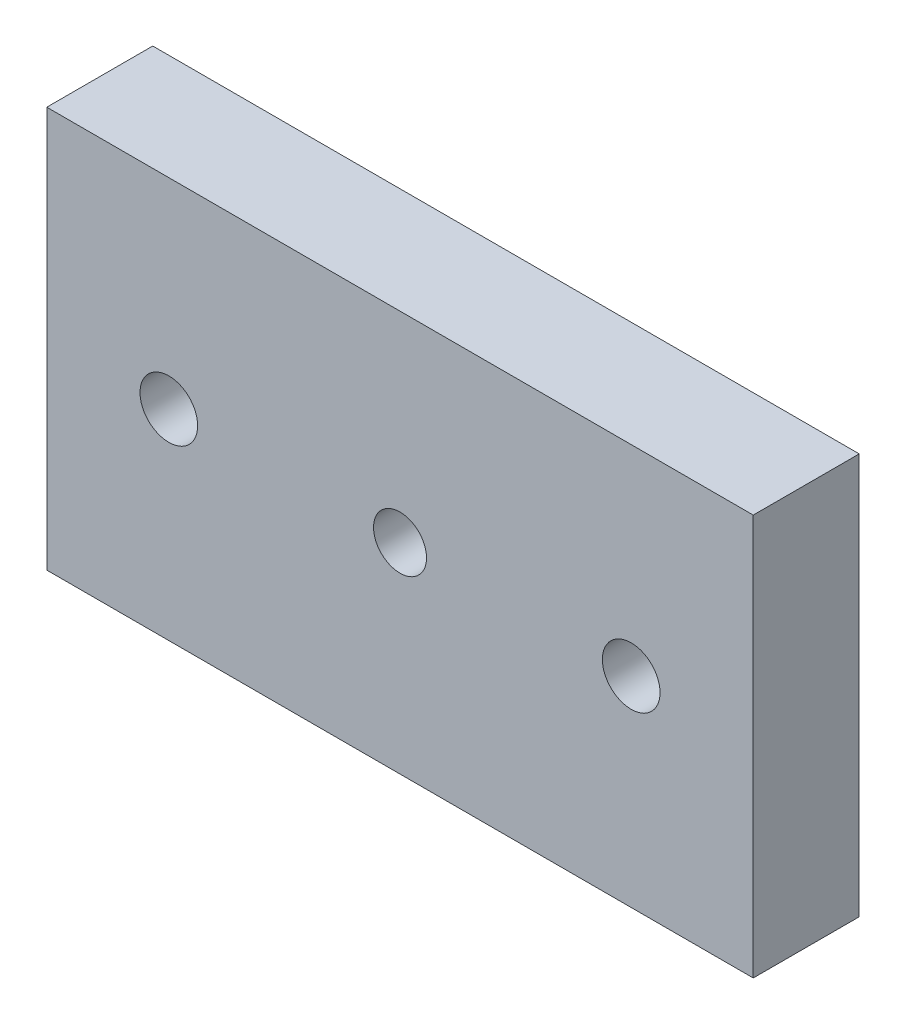
ISO-10303-21;
HEADER;
FILE_DESCRIPTION(('STEP AP214'),'2;1');
FILE_NAME('part.step','',(''),(''),'','','');
FILE_SCHEMA(('AUTOMOTIVE_DESIGN { 1 0 10303 214 1 1 1 1 }'));
ENDSEC;
DATA;
#1=APPLICATION_CONTEXT('core data for automotive mechanical design processes');
#2=APPLICATION_PROTOCOL_DEFINITION('international standard','automotive_design',2000,#1);
#3=PRODUCT_CONTEXT('',#1,'mechanical');
#4=PRODUCT('Part','Part','',(#3));
#5=PRODUCT_RELATED_PRODUCT_CATEGORY('part','',(#4));
#6=PRODUCT_DEFINITION_FORMATION('','',#4);
#7=PRODUCT_DEFINITION_CONTEXT('part definition',#1,'design');
#8=PRODUCT_DEFINITION('design','',#6,#7);
#9=PRODUCT_DEFINITION_SHAPE('','',#8);
#10=(LENGTH_UNIT() NAMED_UNIT(*) SI_UNIT(.MILLI.,.METRE.));
#11=(NAMED_UNIT(*) PLANE_ANGLE_UNIT() SI_UNIT($,.RADIAN.));
#12=(NAMED_UNIT(*) SI_UNIT($,.STERADIAN.) SOLID_ANGLE_UNIT());
#13=UNCERTAINTY_MEASURE_WITH_UNIT(LENGTH_MEASURE(1.E-05),#10,'distance_accuracy_value','');
#14=(GEOMETRIC_REPRESENTATION_CONTEXT(3) GLOBAL_UNCERTAINTY_ASSIGNED_CONTEXT((#13)) GLOBAL_UNIT_ASSIGNED_CONTEXT((#10,
#11,#12)) REPRESENTATION_CONTEXT('',''));
#15=CARTESIAN_POINT('',(0.,0.,0.));
#16=DIRECTION('',(0.,0.,1.));
#17=DIRECTION('',(1.,0.,0.));
#18=AXIS2_PLACEMENT_3D('',#15,#16,#17);
#19=CARTESIAN_POINT('',(20.,11.35,-6.));
#20=DIRECTION('',(1.,0.,0.));
#21=DIRECTION('',(0.,1.,0.));
#22=AXIS2_PLACEMENT_3D('',#19,#20,#21);
#23=PLANE('',#22);
#24=DIRECTION('',(0.,1.,0.));
#25=VECTOR('',#24,1.);
#26=CARTESIAN_POINT('',(20.,11.35,0.));
#27=LINE('',#26,#25);
#28=CARTESIAN_POINT('',(20.,-11.35,0.));
#29=VERTEX_POINT('',#28);
#30=CARTESIAN_POINT('',(20.,11.35,0.));
#31=VERTEX_POINT('',#30);
#32=EDGE_CURVE('E98',#29,#31,#27,.T.);
#33=ORIENTED_EDGE('',*,*,#32,.F.);
#34=DIRECTION('',(0.,0.,1.));
#35=VECTOR('',#34,1.);
#36=CARTESIAN_POINT('',(20.,-11.35,-6.));
#37=LINE('',#36,#35);
#38=CARTESIAN_POINT('',(20.,-11.35,-6.));
#39=VERTEX_POINT('',#38);
#40=EDGE_CURVE('E11',#39,#29,#37,.T.);
#41=ORIENTED_EDGE('',*,*,#40,.F.);
#42=DIRECTION('',(0.,1.,0.));
#43=VECTOR('',#42,1.);
#44=CARTESIAN_POINT('',(20.,11.35,-6.));
#45=LINE('',#44,#43);
#46=CARTESIAN_POINT('',(20.,11.35,-6.));
#47=VERTEX_POINT('',#46);
#48=EDGE_CURVE('E91',#39,#47,#45,.T.);
#49=ORIENTED_EDGE('',*,*,#48,.T.);
#50=DIRECTION('',(0.,0.,1.));
#51=VECTOR('',#50,1.);
#52=CARTESIAN_POINT('',(20.,11.35,-6.));
#53=LINE('',#52,#51);
#54=EDGE_CURVE('E36',#47,#31,#53,.T.);
#55=ORIENTED_EDGE('',*,*,#54,.T.);
#56=EDGE_LOOP('',(#33,#41,#49,#55));
#57=FACE_BOUND('',#56,.T.);
#58=ADVANCED_FACE('F33',(#57),#23,.T.);
#59=CARTESIAN_POINT('',(-20.,-11.35,-6.));
#60=DIRECTION('',(0.,-1.,0.));
#61=DIRECTION('',(0.,0.,-1.));
#62=AXIS2_PLACEMENT_3D('',#59,#60,#61);
#63=PLANE('',#62);
#64=DIRECTION('',(1.,0.,0.));
#65=VECTOR('',#64,1.);
#66=CARTESIAN_POINT('',(-20.,-11.35,0.));
#67=LINE('',#66,#65);
#68=CARTESIAN_POINT('',(-20.,-11.35,0.));
#69=VERTEX_POINT('',#68);
#70=EDGE_CURVE('E93',#69,#29,#67,.T.);
#71=ORIENTED_EDGE('',*,*,#70,.F.);
#72=DIRECTION('',(0.,0.,1.));
#73=VECTOR('',#72,1.);
#74=CARTESIAN_POINT('',(-20.,-11.35,-6.));
#75=LINE('',#74,#73);
#76=CARTESIAN_POINT('',(-20.,-11.35,-6.));
#77=VERTEX_POINT('',#76);
#78=EDGE_CURVE('E42',#77,#69,#75,.T.);
#79=ORIENTED_EDGE('',*,*,#78,.F.);
#80=DIRECTION('',(1.,0.,0.));
#81=VECTOR('',#80,1.);
#82=CARTESIAN_POINT('',(-20.,-11.35,-6.));
#83=LINE('',#82,#81);
#84=EDGE_CURVE('E88',#77,#39,#83,.T.);
#85=ORIENTED_EDGE('',*,*,#84,.T.);
#86=ORIENTED_EDGE('',*,*,#40,.T.);
#87=EDGE_LOOP('',(#71,#79,#85,#86));
#88=FACE_BOUND('',#87,.T.);
#89=ADVANCED_FACE('F109',(#88),#63,.T.);
#90=CARTESIAN_POINT('',(-20.,11.35,-6.));
#91=DIRECTION('',(-1.,0.,0.));
#92=DIRECTION('',(0.,-1.,0.));
#93=AXIS2_PLACEMENT_3D('',#90,#91,#92);
#94=PLANE('',#93);
#95=DIRECTION('',(0.,-1.,0.));
#96=VECTOR('',#95,1.);
#97=CARTESIAN_POINT('',(-20.,11.35,0.));
#98=LINE('',#97,#96);
#99=CARTESIAN_POINT('',(-20.,11.35,0.));
#100=VERTEX_POINT('',#99);
#101=EDGE_CURVE('E83',#100,#69,#98,.T.);
#102=ORIENTED_EDGE('',*,*,#101,.F.);
#103=DIRECTION('',(0.,0.,1.));
#104=VECTOR('',#103,1.);
#105=CARTESIAN_POINT('',(-20.,11.35,-6.));
#106=LINE('',#105,#104);
#107=CARTESIAN_POINT('',(-20.,11.35,-6.));
#108=VERTEX_POINT('',#107);
#109=EDGE_CURVE('E78',#108,#100,#106,.T.);
#110=ORIENTED_EDGE('',*,*,#109,.F.);
#111=DIRECTION('',(0.,-1.,0.));
#112=VECTOR('',#111,1.);
#113=CARTESIAN_POINT('',(-20.,11.35,-6.));
#114=LINE('',#113,#112);
#115=EDGE_CURVE('E81',#108,#77,#114,.T.);
#116=ORIENTED_EDGE('',*,*,#115,.T.);
#117=ORIENTED_EDGE('',*,*,#78,.T.);
#118=EDGE_LOOP('',(#102,#110,#116,#117));
#119=FACE_BOUND('',#118,.T.);
#120=ADVANCED_FACE('F80',(#119),#94,.T.);
#121=CARTESIAN_POINT('',(-20.,11.35,-6.));
#122=DIRECTION('',(0.,1.,0.));
#123=DIRECTION('',(0.,0.,1.));
#124=AXIS2_PLACEMENT_3D('',#121,#122,#123);
#125=PLANE('',#124);
#126=DIRECTION('',(-1.,0.,0.));
#127=VECTOR('',#126,1.);
#128=CARTESIAN_POINT('',(-20.,11.35,0.));
#129=LINE('',#128,#127);
#130=EDGE_CURVE('E101',#31,#100,#129,.T.);
#131=ORIENTED_EDGE('',*,*,#130,.F.);
#132=ORIENTED_EDGE('',*,*,#54,.F.);
#133=DIRECTION('',(-1.,0.,0.));
#134=VECTOR('',#133,1.);
#135=CARTESIAN_POINT('',(-20.,11.35,-6.));
#136=LINE('',#135,#134);
#137=EDGE_CURVE('E87',#47,#108,#136,.T.);
#138=ORIENTED_EDGE('',*,*,#137,.T.);
#139=ORIENTED_EDGE('',*,*,#109,.T.);
#140=EDGE_LOOP('',(#131,#132,#138,#139));
#141=FACE_BOUND('',#140,.T.);
#142=ADVANCED_FACE('F90',(#141),#125,.T.);
#143=CARTESIAN_POINT('',(0.,0.,-6.));
#144=DIRECTION('',(0.,0.,1.));
#145=DIRECTION('',(1.,0.,0.));
#146=AXIS2_PLACEMENT_3D('',#143,#144,#145);
#147=PLANE('',#146);
#148=CARTESIAN_POINT('',(0.,0.,-6.));
#149=DIRECTION('',(0.,0.,1.));
#150=DIRECTION('',(1.,0.,0.));
#151=AXIS2_PLACEMENT_3D('',#148,#149,#150);
#152=CIRCLE('',#151,1.5);
#153=CARTESIAN_POINT('',(1.5,0.,-6.));
#154=VERTEX_POINT('',#153);
#155=EDGE_CURVE('E146',#154,#154,#152,.T.);
#156=ORIENTED_EDGE('',*,*,#155,.T.);
#157=EDGE_LOOP('',(#156));
#158=FACE_BOUND('',#157,.T.);
#159=CARTESIAN_POINT('',(-13.09,0.,-6.));
#160=DIRECTION('',(0.,0.,1.));
#161=DIRECTION('',(1.,0.,0.));
#162=AXIS2_PLACEMENT_3D('',#159,#160,#161);
#163=CIRCLE('',#162,1.63195);
#164=CARTESIAN_POINT('',(-11.45805,0.,-6.));
#165=VERTEX_POINT('',#164);
#166=EDGE_CURVE('E156',#165,#165,#163,.T.);
#167=ORIENTED_EDGE('',*,*,#166,.T.);
#168=EDGE_LOOP('',(#167));
#169=FACE_BOUND('',#168,.T.);
#170=CARTESIAN_POINT('',(13.09,0.,-6.));
#171=DIRECTION('',(0.,0.,1.));
#172=DIRECTION('',(1.,0.,0.));
#173=AXIS2_PLACEMENT_3D('',#170,#171,#172);
#174=CIRCLE('',#173,1.63195);
#175=CARTESIAN_POINT('',(14.72195,0.,-6.));
#176=VERTEX_POINT('',#175);
#177=EDGE_CURVE('E102',#176,#176,#174,.T.);
#178=ORIENTED_EDGE('',*,*,#177,.T.);
#179=EDGE_LOOP('',(#178));
#180=FACE_BOUND('',#179,.T.);
#181=ORIENTED_EDGE('',*,*,#48,.F.);
#182=ORIENTED_EDGE('',*,*,#84,.F.);
#183=ORIENTED_EDGE('',*,*,#115,.F.);
#184=ORIENTED_EDGE('',*,*,#137,.F.);
#185=EDGE_LOOP('',(#181,#182,#183,#184));
#186=FACE_BOUND('',#185,.T.);
#187=ADVANCED_FACE('F86',(#158,#169,#180,#186),#147,.F.);
#188=CARTESIAN_POINT('',(0.,0.,0.));
#189=DIRECTION('',(0.,0.,1.));
#190=DIRECTION('',(1.,0.,0.));
#191=AXIS2_PLACEMENT_3D('',#188,#189,#190);
#192=PLANE('',#191);
#193=CARTESIAN_POINT('',(0.,0.,0.));
#194=DIRECTION('',(0.,0.,1.));
#195=DIRECTION('',(1.,0.,0.));
#196=AXIS2_PLACEMENT_3D('',#193,#194,#195);
#197=CIRCLE('',#196,1.5);
#198=CARTESIAN_POINT('',(1.5,0.,0.));
#199=VERTEX_POINT('',#198);
#200=EDGE_CURVE('E149',#199,#199,#197,.T.);
#201=ORIENTED_EDGE('',*,*,#200,.F.);
#202=EDGE_LOOP('',(#201));
#203=FACE_BOUND('',#202,.T.);
#204=CARTESIAN_POINT('',(-13.09,0.,0.));
#205=DIRECTION('',(0.,0.,1.));
#206=DIRECTION('',(1.,0.,0.));
#207=AXIS2_PLACEMENT_3D('',#204,#205,#206);
#208=CIRCLE('',#207,1.63194999999999);
#209=CARTESIAN_POINT('',(-11.45805,0.,0.));
#210=VERTEX_POINT('',#209);
#211=EDGE_CURVE('E151',#210,#210,#208,.T.);
#212=ORIENTED_EDGE('',*,*,#211,.F.);
#213=EDGE_LOOP('',(#212));
#214=FACE_BOUND('',#213,.T.);
#215=CARTESIAN_POINT('',(13.09,0.,0.));
#216=DIRECTION('',(0.,0.,1.));
#217=DIRECTION('',(1.,0.,0.));
#218=AXIS2_PLACEMENT_3D('',#215,#216,#217);
#219=CIRCLE('',#218,1.63194999999999);
#220=CARTESIAN_POINT('',(14.72195,0.,0.));
#221=VERTEX_POINT('',#220);
#222=EDGE_CURVE('E159',#221,#221,#219,.T.);
#223=ORIENTED_EDGE('',*,*,#222,.F.);
#224=EDGE_LOOP('',(#223));
#225=FACE_BOUND('',#224,.T.);
#226=ORIENTED_EDGE('',*,*,#32,.T.);
#227=ORIENTED_EDGE('',*,*,#130,.T.);
#228=ORIENTED_EDGE('',*,*,#101,.T.);
#229=ORIENTED_EDGE('',*,*,#70,.T.);
#230=EDGE_LOOP('',(#226,#227,#228,#229));
#231=FACE_BOUND('',#230,.T.);
#232=ADVANCED_FACE('F108',(#203,#214,#225,#231),#192,.T.);
#233=CARTESIAN_POINT('',(13.09,0.,0.));
#234=DIRECTION('',(0.,0.,1.));
#235=DIRECTION('',(1.,0.,0.));
#236=AXIS2_PLACEMENT_3D('',#233,#234,#235);
#237=CYLINDRICAL_SURFACE('',#236,1.63194999999999);
#238=ORIENTED_EDGE('',*,*,#177,.F.);
#239=EDGE_LOOP('',(#238));
#240=FACE_BOUND('',#239,.T.);
#241=ORIENTED_EDGE('',*,*,#222,.T.);
#242=EDGE_LOOP('',(#241));
#243=FACE_BOUND('',#242,.T.);
#244=ADVANCED_FACE('F127',(#240,#243),#237,.F.);
#245=CARTESIAN_POINT('',(-13.09,0.,0.));
#246=DIRECTION('',(0.,0.,1.));
#247=DIRECTION('',(1.,0.,0.));
#248=AXIS2_PLACEMENT_3D('',#245,#246,#247);
#249=CYLINDRICAL_SURFACE('',#248,1.63194999999999);
#250=ORIENTED_EDGE('',*,*,#166,.F.);
#251=EDGE_LOOP('',(#250));
#252=FACE_BOUND('',#251,.T.);
#253=ORIENTED_EDGE('',*,*,#211,.T.);
#254=EDGE_LOOP('',(#253));
#255=FACE_BOUND('',#254,.T.);
#256=ADVANCED_FACE('F134',(#252,#255),#249,.F.);
#257=CARTESIAN_POINT('',(0.,0.,0.));
#258=DIRECTION('',(0.,0.,1.));
#259=DIRECTION('',(1.,0.,0.));
#260=AXIS2_PLACEMENT_3D('',#257,#258,#259);
#261=CYLINDRICAL_SURFACE('',#260,1.5);
#262=ORIENTED_EDGE('',*,*,#155,.F.);
#263=EDGE_LOOP('',(#262));
#264=FACE_BOUND('',#263,.T.);
#265=ORIENTED_EDGE('',*,*,#200,.T.);
#266=EDGE_LOOP('',(#265));
#267=FACE_BOUND('',#266,.T.);
#268=ADVANCED_FACE('F138',(#264,#267),#261,.F.);
#269=CLOSED_SHELL('',(#58,#89,#120,#142,#187,#232,#244,#256,#268));
#270=MANIFOLD_SOLID_BREP('B2',#269);
#271=ADVANCED_BREP_SHAPE_REPRESENTATION('',(#18,#270),#14);
#272=SHAPE_DEFINITION_REPRESENTATION(#9,#271);
ENDSEC;
END-ISO-10303-21;
